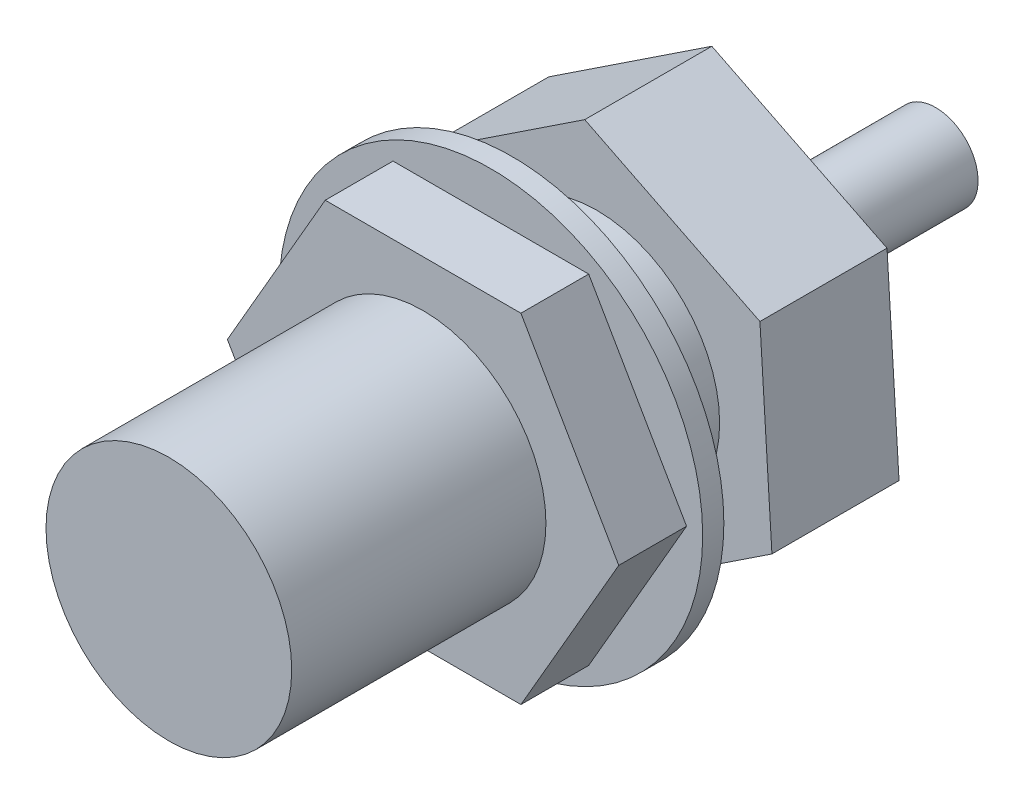
ISO-10303-21;
HEADER;
FILE_DESCRIPTION(('STEP AP214'),'2;1');
FILE_NAME('part.step','',(''),(''),'','','');
FILE_SCHEMA(('AUTOMOTIVE_DESIGN { 1 0 10303 214 1 1 1 1 }'));
ENDSEC;
DATA;
#1=APPLICATION_CONTEXT('core data for automotive mechanical design processes');
#2=APPLICATION_PROTOCOL_DEFINITION('international standard','automotive_design',2000,#1);
#3=PRODUCT_CONTEXT('',#1,'mechanical');
#4=PRODUCT('Part','Part','',(#3));
#5=PRODUCT_RELATED_PRODUCT_CATEGORY('part','',(#4));
#6=PRODUCT_DEFINITION_FORMATION('','',#4);
#7=PRODUCT_DEFINITION_CONTEXT('part definition',#1,'design');
#8=PRODUCT_DEFINITION('design','',#6,#7);
#9=PRODUCT_DEFINITION_SHAPE('','',#8);
#10=(LENGTH_UNIT() NAMED_UNIT(*) SI_UNIT(.MILLI.,.METRE.));
#11=(NAMED_UNIT(*) PLANE_ANGLE_UNIT() SI_UNIT($,.RADIAN.));
#12=(NAMED_UNIT(*) SI_UNIT($,.STERADIAN.) SOLID_ANGLE_UNIT());
#13=UNCERTAINTY_MEASURE_WITH_UNIT(LENGTH_MEASURE(1.E-05),#10,'distance_accuracy_value','');
#14=(GEOMETRIC_REPRESENTATION_CONTEXT(3) GLOBAL_UNCERTAINTY_ASSIGNED_CONTEXT((#13)) GLOBAL_UNIT_ASSIGNED_CONTEXT((#10,
#11,#12)) REPRESENTATION_CONTEXT('',''));
#15=CARTESIAN_POINT('',(0.,0.,0.));
#16=DIRECTION('',(0.,0.,1.));
#17=DIRECTION('',(1.,0.,0.));
#18=AXIS2_PLACEMENT_3D('',#15,#16,#17);
#19=CARTESIAN_POINT('',(0.,0.,3.));
#20=DIRECTION('',(0.,0.,-1.));
#21=DIRECTION('',(-1.,0.,0.));
#22=AXIS2_PLACEMENT_3D('',#19,#20,#21);
#23=CYLINDRICAL_SURFACE('',#22,2.9);
#24=CARTESIAN_POINT('',(0.,0.,3.));
#25=DIRECTION('',(0.,0.,1.));
#26=DIRECTION('',(1.,0.,0.));
#27=AXIS2_PLACEMENT_3D('',#24,#25,#26);
#28=CIRCLE('',#27,2.9);
#29=CARTESIAN_POINT('',(2.9,0.,3.));
#30=VERTEX_POINT('',#29);
#31=EDGE_CURVE('E148',#30,#30,#28,.T.);
#32=ORIENTED_EDGE('',*,*,#31,.F.);
#33=EDGE_LOOP('',(#32));
#34=FACE_BOUND('',#33,.T.);
#35=CARTESIAN_POINT('',(0.,0.,-3.));
#36=DIRECTION('',(0.,0.,1.));
#37=DIRECTION('',(1.,0.,0.));
#38=AXIS2_PLACEMENT_3D('',#35,#36,#37);
#39=CIRCLE('',#38,2.9);
#40=CARTESIAN_POINT('',(2.9,0.,-3.));
#41=VERTEX_POINT('',#40);
#42=EDGE_CURVE('E39',#41,#41,#39,.T.);
#43=ORIENTED_EDGE('',*,*,#42,.T.);
#44=EDGE_LOOP('',(#43));
#45=FACE_BOUND('',#44,.T.);
#46=ADVANCED_FACE('F36',(#34,#45),#23,.T.);
#47=CARTESIAN_POINT('',(0.,0.,3.));
#48=DIRECTION('',(0.,0.,1.));
#49=DIRECTION('',(1.,0.,0.));
#50=AXIS2_PLACEMENT_3D('',#47,#48,#49);
#51=PLANE('',#50);
#52=ORIENTED_EDGE('',*,*,#31,.T.);
#53=EDGE_LOOP('',(#52));
#54=FACE_BOUND('',#53,.T.);
#55=ADVANCED_FACE('F178',(#54),#51,.T.);
#56=CARTESIAN_POINT('',(-2.3094010767585,-4.,-4.6));
#57=DIRECTION('',(0.866025403784439,0.5,0.));
#58=DIRECTION('',(-0.5,0.866025403784439,0.));
#59=AXIS2_PLACEMENT_3D('',#56,#57,#58);
#60=PLANE('',#59);
#61=DIRECTION('',(-0.5,0.866025403784439,0.));
#62=VECTOR('',#61,1.);
#63=CARTESIAN_POINT('',(-2.3094010767585,-4.,-3.));
#64=LINE('',#63,#62);
#65=CARTESIAN_POINT('',(-2.3094010767585,-4.,-3.));
#66=VERTEX_POINT('',#65);
#67=CARTESIAN_POINT('',(-4.61880215351701,0.,-3.));
#68=VERTEX_POINT('',#67);
#69=EDGE_CURVE('E132',#66,#68,#64,.T.);
#70=ORIENTED_EDGE('',*,*,#69,.T.);
#71=DIRECTION('',(0.,0.,1.));
#72=VECTOR('',#71,1.);
#73=CARTESIAN_POINT('',(-4.61880215351701,0.,-4.6));
#74=LINE('',#73,#72);
#75=CARTESIAN_POINT('',(-4.61880215351701,0.,-4.6));
#76=VERTEX_POINT('',#75);
#77=EDGE_CURVE('E147',#76,#68,#74,.T.);
#78=ORIENTED_EDGE('',*,*,#77,.F.);
#79=DIRECTION('',(-0.5,0.866025403784439,0.));
#80=VECTOR('',#79,1.);
#81=CARTESIAN_POINT('',(-2.3094010767585,-4.,-4.6));
#82=LINE('',#81,#80);
#83=CARTESIAN_POINT('',(-2.3094010767585,-4.,-4.6));
#84=VERTEX_POINT('',#83);
#85=EDGE_CURVE('E124',#84,#76,#82,.T.);
#86=ORIENTED_EDGE('',*,*,#85,.F.);
#87=DIRECTION('',(0.,0.,1.));
#88=VECTOR('',#87,1.);
#89=CARTESIAN_POINT('',(-2.3094010767585,-4.,-4.6));
#90=LINE('',#89,#88);
#91=EDGE_CURVE('E131',#84,#66,#90,.T.);
#92=ORIENTED_EDGE('',*,*,#91,.T.);
#93=EDGE_LOOP('',(#70,#78,#86,#92));
#94=FACE_BOUND('',#93,.T.);
#95=ADVANCED_FACE('F165',(#94),#60,.F.);
#96=CARTESIAN_POINT('',(-4.61880215351701,0.,-4.6));
#97=DIRECTION('',(0.866025403784438,-0.5,0.));
#98=DIRECTION('',(0.5,0.866025403784438,0.));
#99=AXIS2_PLACEMENT_3D('',#96,#97,#98);
#100=PLANE('',#99);
#101=DIRECTION('',(0.5,0.866025403784438,0.));
#102=VECTOR('',#101,1.);
#103=CARTESIAN_POINT('',(-4.61880215351701,0.,-3.));
#104=LINE('',#103,#102);
#105=CARTESIAN_POINT('',(-2.3094010767585,4.,-3.));
#106=VERTEX_POINT('',#105);
#107=EDGE_CURVE('E135',#68,#106,#104,.T.);
#108=ORIENTED_EDGE('',*,*,#107,.T.);
#109=DIRECTION('',(0.,0.,1.));
#110=VECTOR('',#109,1.);
#111=CARTESIAN_POINT('',(-2.3094010767585,4.,-4.6));
#112=LINE('',#111,#110);
#113=CARTESIAN_POINT('',(-2.3094010767585,4.,-4.6));
#114=VERTEX_POINT('',#113);
#115=EDGE_CURVE('E110',#114,#106,#112,.T.);
#116=ORIENTED_EDGE('',*,*,#115,.F.);
#117=DIRECTION('',(0.5,0.866025403784438,0.));
#118=VECTOR('',#117,1.);
#119=CARTESIAN_POINT('',(-4.61880215351701,0.,-4.6));
#120=LINE('',#119,#118);
#121=EDGE_CURVE('E91',#76,#114,#120,.T.);
#122=ORIENTED_EDGE('',*,*,#121,.F.);
#123=ORIENTED_EDGE('',*,*,#77,.T.);
#124=EDGE_LOOP('',(#108,#116,#122,#123));
#125=FACE_BOUND('',#124,.T.);
#126=ADVANCED_FACE('F186',(#125),#100,.F.);
#127=CARTESIAN_POINT('',(-2.3094010767585,4.,-4.6));
#128=DIRECTION('',(0.,-1.,0.));
#129=DIRECTION('',(0.,0.,-1.));
#130=AXIS2_PLACEMENT_3D('',#127,#128,#129);
#131=PLANE('',#130);
#132=DIRECTION('',(1.,0.,0.));
#133=VECTOR('',#132,1.);
#134=CARTESIAN_POINT('',(-2.3094010767585,4.,-3.));
#135=LINE('',#134,#133);
#136=CARTESIAN_POINT('',(2.3094010767585,4.,-3.));
#137=VERTEX_POINT('',#136);
#138=EDGE_CURVE('E107',#106,#137,#135,.T.);
#139=ORIENTED_EDGE('',*,*,#138,.T.);
#140=DIRECTION('',(0.,0.,1.));
#141=VECTOR('',#140,1.);
#142=CARTESIAN_POINT('',(2.3094010767585,4.,-4.6));
#143=LINE('',#142,#141);
#144=CARTESIAN_POINT('',(2.3094010767585,4.,-4.6));
#145=VERTEX_POINT('',#144);
#146=EDGE_CURVE('E100',#145,#137,#143,.T.);
#147=ORIENTED_EDGE('',*,*,#146,.F.);
#148=DIRECTION('',(1.,0.,0.));
#149=VECTOR('',#148,1.);
#150=CARTESIAN_POINT('',(-2.3094010767585,4.,-4.6));
#151=LINE('',#150,#149);
#152=EDGE_CURVE('E105',#114,#145,#151,.T.);
#153=ORIENTED_EDGE('',*,*,#152,.F.);
#154=ORIENTED_EDGE('',*,*,#115,.T.);
#155=EDGE_LOOP('',(#139,#147,#153,#154));
#156=FACE_BOUND('',#155,.T.);
#157=ADVANCED_FACE('F102',(#156),#131,.F.);
#158=CARTESIAN_POINT('',(2.3094010767585,4.,-4.6));
#159=DIRECTION('',(-0.866025403784438,-0.5,0.));
#160=DIRECTION('',(0.5,-0.866025403784439,0.));
#161=AXIS2_PLACEMENT_3D('',#158,#159,#160);
#162=PLANE('',#161);
#163=DIRECTION('',(0.5,-0.866025403784438,0.));
#164=VECTOR('',#163,1.);
#165=CARTESIAN_POINT('',(2.3094010767585,4.,-3.));
#166=LINE('',#165,#164);
#167=CARTESIAN_POINT('',(4.61880215351701,0.,-3.));
#168=VERTEX_POINT('',#167);
#169=EDGE_CURVE('E139',#137,#168,#166,.T.);
#170=ORIENTED_EDGE('',*,*,#169,.T.);
#171=DIRECTION('',(0.,0.,1.));
#172=VECTOR('',#171,1.);
#173=CARTESIAN_POINT('',(4.61880215351701,0.,-4.6));
#174=LINE('',#173,#172);
#175=CARTESIAN_POINT('',(4.61880215351701,0.,-4.6));
#176=VERTEX_POINT('',#175);
#177=EDGE_CURVE('E111',#176,#168,#174,.T.);
#178=ORIENTED_EDGE('',*,*,#177,.F.);
#179=DIRECTION('',(0.5,-0.866025403784438,0.));
#180=VECTOR('',#179,1.);
#181=CARTESIAN_POINT('',(2.3094010767585,4.,-4.6));
#182=LINE('',#181,#180);
#183=EDGE_CURVE('E114',#145,#176,#182,.T.);
#184=ORIENTED_EDGE('',*,*,#183,.F.);
#185=ORIENTED_EDGE('',*,*,#146,.T.);
#186=EDGE_LOOP('',(#170,#178,#184,#185));
#187=FACE_BOUND('',#186,.T.);
#188=ADVANCED_FACE('F115',(#187),#162,.F.);
#189=CARTESIAN_POINT('',(4.61880215351701,0.,-4.6));
#190=DIRECTION('',(-0.866025403784438,0.5,0.));
#191=DIRECTION('',(-0.5,-0.866025403784439,0.));
#192=AXIS2_PLACEMENT_3D('',#189,#190,#191);
#193=PLANE('',#192);
#194=DIRECTION('',(-0.5,-0.866025403784439,0.));
#195=VECTOR('',#194,1.);
#196=CARTESIAN_POINT('',(4.61880215351701,0.,-3.));
#197=LINE('',#196,#195);
#198=CARTESIAN_POINT('',(2.3094010767585,-4.,-3.));
#199=VERTEX_POINT('',#198);
#200=EDGE_CURVE('E76',#168,#199,#197,.T.);
#201=ORIENTED_EDGE('',*,*,#200,.T.);
#202=DIRECTION('',(0.,0.,1.));
#203=VECTOR('',#202,1.);
#204=CARTESIAN_POINT('',(2.3094010767585,-4.,-4.6));
#205=LINE('',#204,#203);
#206=CARTESIAN_POINT('',(2.3094010767585,-4.,-4.6));
#207=VERTEX_POINT('',#206);
#208=EDGE_CURVE('E54',#207,#199,#205,.T.);
#209=ORIENTED_EDGE('',*,*,#208,.F.);
#210=DIRECTION('',(-0.5,-0.866025403784439,0.));
#211=VECTOR('',#210,1.);
#212=CARTESIAN_POINT('',(4.61880215351701,0.,-4.6));
#213=LINE('',#212,#211);
#214=EDGE_CURVE('E118',#176,#207,#213,.T.);
#215=ORIENTED_EDGE('',*,*,#214,.F.);
#216=ORIENTED_EDGE('',*,*,#177,.T.);
#217=EDGE_LOOP('',(#201,#209,#215,#216));
#218=FACE_BOUND('',#217,.T.);
#219=ADVANCED_FACE('F168',(#218),#193,.F.);
#220=CARTESIAN_POINT('',(2.3094010767585,-4.,-4.6));
#221=DIRECTION('',(0.,1.,0.));
#222=DIRECTION('',(-1.,0.,0.));
#223=AXIS2_PLACEMENT_3D('',#220,#221,#222);
#224=PLANE('',#223);
#225=DIRECTION('',(-1.,0.,0.));
#226=VECTOR('',#225,1.);
#227=CARTESIAN_POINT('',(2.3094010767585,-4.,-3.));
#228=LINE('',#227,#226);
#229=EDGE_CURVE('E82',#199,#66,#228,.T.);
#230=ORIENTED_EDGE('',*,*,#229,.T.);
#231=ORIENTED_EDGE('',*,*,#91,.F.);
#232=DIRECTION('',(-1.,0.,0.));
#233=VECTOR('',#232,1.);
#234=CARTESIAN_POINT('',(2.3094010767585,-4.,-4.6));
#235=LINE('',#234,#233);
#236=EDGE_CURVE('E129',#207,#84,#235,.T.);
#237=ORIENTED_EDGE('',*,*,#236,.F.);
#238=ORIENTED_EDGE('',*,*,#208,.T.);
#239=EDGE_LOOP('',(#230,#231,#237,#238));
#240=FACE_BOUND('',#239,.T.);
#241=ADVANCED_FACE('F161',(#240),#224,.F.);
#242=CARTESIAN_POINT('',(0.,0.,-3.));
#243=DIRECTION('',(0.,0.,-1.));
#244=DIRECTION('',(-1.,0.,0.));
#245=AXIS2_PLACEMENT_3D('',#242,#243,#244);
#246=PLANE('',#245);
#247=ORIENTED_EDGE('',*,*,#42,.F.);
#248=EDGE_LOOP('',(#247));
#249=FACE_BOUND('',#248,.T.);
#250=ORIENTED_EDGE('',*,*,#69,.F.);
#251=ORIENTED_EDGE('',*,*,#229,.F.);
#252=ORIENTED_EDGE('',*,*,#200,.F.);
#253=ORIENTED_EDGE('',*,*,#169,.F.);
#254=ORIENTED_EDGE('',*,*,#138,.F.);
#255=ORIENTED_EDGE('',*,*,#107,.F.);
#256=EDGE_LOOP('',(#250,#251,#252,#253,#254,#255));
#257=FACE_BOUND('',#256,.T.);
#258=ADVANCED_FACE('F158',(#249,#257),#246,.F.);
#259=CARTESIAN_POINT('',(0.,0.,-4.6));
#260=DIRECTION('',(0.,0.,-1.));
#261=DIRECTION('',(-1.,0.,0.));
#262=AXIS2_PLACEMENT_3D('',#259,#260,#261);
#263=PLANE('',#262);
#264=CARTESIAN_POINT('',(0.,0.,-4.6));
#265=DIRECTION('',(0.,0.,-1.));
#266=DIRECTION('',(-1.,0.,0.));
#267=AXIS2_PLACEMENT_3D('',#264,#265,#266);
#268=CIRCLE('',#267,5.);
#269=CARTESIAN_POINT('',(-5.,0.,-4.6));
#270=VERTEX_POINT('',#269);
#271=EDGE_CURVE('E418',#270,#270,#268,.T.);
#272=ORIENTED_EDGE('',*,*,#271,.F.);
#273=EDGE_LOOP('',(#272));
#274=FACE_BOUND('',#273,.T.);
#275=ORIENTED_EDGE('',*,*,#236,.T.);
#276=ORIENTED_EDGE('',*,*,#85,.T.);
#277=ORIENTED_EDGE('',*,*,#121,.T.);
#278=ORIENTED_EDGE('',*,*,#152,.T.);
#279=ORIENTED_EDGE('',*,*,#183,.T.);
#280=ORIENTED_EDGE('',*,*,#214,.T.);
#281=EDGE_LOOP('',(#275,#276,#277,#278,#279,#280));
#282=FACE_BOUND('',#281,.T.);
#283=ADVANCED_FACE('F121',(#274,#282),#263,.F.);
#284=CARTESIAN_POINT('',(0.,0.,-5.1));
#285=DIRECTION('',(0.,0.,1.));
#286=DIRECTION('',(1.,0.,0.));
#287=AXIS2_PLACEMENT_3D('',#284,#285,#286);
#288=CYLINDRICAL_SURFACE('',#287,5.);
#289=CARTESIAN_POINT('',(0.,0.,-5.1));
#290=DIRECTION('',(0.,0.,-1.));
#291=DIRECTION('',(-1.,0.,0.));
#292=AXIS2_PLACEMENT_3D('',#289,#290,#291);
#293=CIRCLE('',#292,5.);
#294=CARTESIAN_POINT('',(-5.,0.,-5.1));
#295=VERTEX_POINT('',#294);
#296=EDGE_CURVE('E136',#295,#295,#293,.T.);
#297=ORIENTED_EDGE('',*,*,#296,.F.);
#298=EDGE_LOOP('',(#297));
#299=FACE_BOUND('',#298,.T.);
#300=ORIENTED_EDGE('',*,*,#271,.T.);
#301=EDGE_LOOP('',(#300));
#302=FACE_BOUND('',#301,.T.);
#303=ADVANCED_FACE('F220',(#299,#302),#288,.T.);
#304=CARTESIAN_POINT('',(0.,0.,-5.1));
#305=DIRECTION('',(0.,0.,-1.));
#306=DIRECTION('',(-1.,0.,0.));
#307=AXIS2_PLACEMENT_3D('',#304,#305,#306);
#308=PLANE('',#307);
#309=CARTESIAN_POINT('',(0.,0.,-5.1));
#310=DIRECTION('',(0.,0.,-1.));
#311=DIRECTION('',(-1.,0.,0.));
#312=AXIS2_PLACEMENT_3D('',#309,#310,#311);
#313=CIRCLE('',#312,2.9);
#314=CARTESIAN_POINT('',(-2.9,0.,-5.1));
#315=VERTEX_POINT('',#314);
#316=EDGE_CURVE('E45',#315,#315,#313,.T.);
#317=ORIENTED_EDGE('',*,*,#316,.F.);
#318=EDGE_LOOP('',(#317));
#319=FACE_BOUND('',#318,.T.);
#320=ORIENTED_EDGE('',*,*,#296,.T.);
#321=EDGE_LOOP('',(#320));
#322=FACE_BOUND('',#321,.T.);
#323=ADVANCED_FACE('F230',(#319,#322),#308,.T.);
#324=CARTESIAN_POINT('',(0.,0.,-7.1));
#325=DIRECTION('',(0.,0.,1.));
#326=DIRECTION('',(1.,0.,0.));
#327=AXIS2_PLACEMENT_3D('',#324,#325,#326);
#328=CYLINDRICAL_SURFACE('',#327,2.9);
#329=CARTESIAN_POINT('',(0.,0.,-7.1));
#330=DIRECTION('',(0.,0.,-1.));
#331=DIRECTION('',(-1.,0.,0.));
#332=AXIS2_PLACEMENT_3D('',#329,#330,#331);
#333=CIRCLE('',#332,2.9);
#334=CARTESIAN_POINT('',(-2.9,0.,-7.1));
#335=VERTEX_POINT('',#334);
#336=EDGE_CURVE('E416',#335,#335,#333,.T.);
#337=ORIENTED_EDGE('',*,*,#336,.F.);
#338=EDGE_LOOP('',(#337));
#339=FACE_BOUND('',#338,.T.);
#340=ORIENTED_EDGE('',*,*,#316,.T.);
#341=EDGE_LOOP('',(#340));
#342=FACE_BOUND('',#341,.T.);
#343=ADVANCED_FACE('F240',(#339,#342),#328,.T.);
#344=CARTESIAN_POINT('',(-3.85049220223233,-2.55089065502255,-10.1));
#345=DIRECTION('',(0.998109301609293,0.0614639897908421,0.));
#346=DIRECTION('',(-0.0614639897908421,0.998109301609293,0.));
#347=AXIS2_PLACEMENT_3D('',#344,#345,#346);
#348=PLANE('',#347);
#349=DIRECTION('',(-0.0614639897908421,0.998109301609293,0.));
#350=VECTOR('',#349,1.);
#351=CARTESIAN_POINT('',(-3.85049220223233,-2.55089065502255,-7.1));
#352=LINE('',#351,#350);
#353=CARTESIAN_POINT('',(-3.85049220223233,-2.55089065502255,-7.1));
#354=VERTEX_POINT('',#353);
#355=CARTESIAN_POINT('',(-4.13438221064202,2.05917873669581,-7.1));
#356=VERTEX_POINT('',#355);
#357=EDGE_CURVE('E360',#354,#356,#352,.T.);
#358=ORIENTED_EDGE('',*,*,#357,.T.);
#359=DIRECTION('',(0.,0.,1.));
#360=VECTOR('',#359,1.);
#361=CARTESIAN_POINT('',(-4.13438221064202,2.05917873669581,-10.1));
#362=LINE('',#361,#360);
#363=CARTESIAN_POINT('',(-4.13438221064202,2.05917873669581,-10.1));
#364=VERTEX_POINT('',#363);
#365=EDGE_CURVE('E413',#364,#356,#362,.T.);
#366=ORIENTED_EDGE('',*,*,#365,.F.);
#367=DIRECTION('',(-0.0614639897908421,0.998109301609293,0.));
#368=VECTOR('',#367,1.);
#369=CARTESIAN_POINT('',(-3.85049220223233,-2.55089065502255,-10.1));
#370=LINE('',#369,#368);
#371=CARTESIAN_POINT('',(-3.85049220223233,-2.55089065502255,-10.1));
#372=VERTEX_POINT('',#371);
#373=EDGE_CURVE('E366',#372,#364,#370,.T.);
#374=ORIENTED_EDGE('',*,*,#373,.F.);
#375=DIRECTION('',(0.,0.,1.));
#376=VECTOR('',#375,1.);
#377=CARTESIAN_POINT('',(-3.85049220223233,-2.55089065502255,-10.1));
#378=LINE('',#377,#376);
#379=EDGE_CURVE('E384',#372,#354,#378,.T.);
#380=ORIENTED_EDGE('',*,*,#379,.T.);
#381=EDGE_LOOP('',(#358,#366,#374,#380));
#382=FACE_BOUND('',#381,.T.);
#383=ADVANCED_FACE('F250',(#382),#348,.F.);
#384=CARTESIAN_POINT('',(-4.13438221064202,2.05917873669581,-10.1));
#385=DIRECTION('',(0.552284027381463,-0.833656016051771,0.));
#386=DIRECTION('',(0.833656016051771,0.552284027381464,0.));
#387=AXIS2_PLACEMENT_3D('',#384,#385,#386);
#388=PLANE('',#387);
#389=DIRECTION('',(0.833656016051771,0.552284027381464,0.));
#390=VECTOR('',#389,1.);
#391=CARTESIAN_POINT('',(-4.13438221064202,2.05917873669581,-7.1));
#392=LINE('',#391,#390);
#393=CARTESIAN_POINT('',(-0.28389000840969,4.61006939171836,-7.1));
#394=VERTEX_POINT('',#393);
#395=EDGE_CURVE('E363',#356,#394,#392,.T.);
#396=ORIENTED_EDGE('',*,*,#395,.T.);
#397=DIRECTION('',(0.,0.,1.));
#398=VECTOR('',#397,1.);
#399=CARTESIAN_POINT('',(-0.28389000840969,4.61006939171836,-10.1));
#400=LINE('',#399,#398);
#401=CARTESIAN_POINT('',(-0.28389000840969,4.61006939171836,-10.1));
#402=VERTEX_POINT('',#401);
#403=EDGE_CURVE('E410',#402,#394,#400,.T.);
#404=ORIENTED_EDGE('',*,*,#403,.F.);
#405=DIRECTION('',(0.833656016051771,0.552284027381464,0.));
#406=VECTOR('',#405,1.);
#407=CARTESIAN_POINT('',(-4.13438221064202,2.05917873669581,-10.1));
#408=LINE('',#407,#406);
#409=EDGE_CURVE('E369',#364,#402,#408,.T.);
#410=ORIENTED_EDGE('',*,*,#409,.F.);
#411=ORIENTED_EDGE('',*,*,#365,.T.);
#412=EDGE_LOOP('',(#396,#404,#410,#411));
#413=FACE_BOUND('',#412,.T.);
#414=ADVANCED_FACE('F260',(#413),#388,.F.);
#415=CARTESIAN_POINT('',(-0.28389000840969,4.61006939171836,-10.1));
#416=DIRECTION('',(-0.44582527422783,-0.895120005842613,0.));
#417=DIRECTION('',(0.895120005842613,-0.44582527422783,0.));
#418=AXIS2_PLACEMENT_3D('',#415,#416,#417);
#419=PLANE('',#418);
#420=DIRECTION('',(0.895120005842613,-0.44582527422783,0.));
#421=VECTOR('',#420,1.);
#422=CARTESIAN_POINT('',(-0.28389000840969,4.61006939171836,-7.1));
#423=LINE('',#422,#421);
#424=CARTESIAN_POINT('',(3.85049220223233,2.55089065502255,-7.1));
#425=VERTEX_POINT('',#424);
#426=EDGE_CURVE('E388',#394,#425,#423,.T.);
#427=ORIENTED_EDGE('',*,*,#426,.T.);
#428=DIRECTION('',(0.,0.,1.));
#429=VECTOR('',#428,1.);
#430=CARTESIAN_POINT('',(3.85049220223233,2.55089065502255,-10.1));
#431=LINE('',#430,#429);
#432=CARTESIAN_POINT('',(3.85049220223233,2.55089065502255,-10.1));
#433=VERTEX_POINT('',#432);
#434=EDGE_CURVE('E407',#433,#425,#431,.T.);
#435=ORIENTED_EDGE('',*,*,#434,.F.);
#436=DIRECTION('',(0.895120005842613,-0.44582527422783,0.));
#437=VECTOR('',#436,1.);
#438=CARTESIAN_POINT('',(-0.28389000840969,4.61006939171836,-10.1));
#439=LINE('',#438,#437);
#440=EDGE_CURVE('E373',#402,#433,#439,.T.);
#441=ORIENTED_EDGE('',*,*,#440,.F.);
#442=ORIENTED_EDGE('',*,*,#403,.T.);
#443=EDGE_LOOP('',(#427,#435,#441,#442));
#444=FACE_BOUND('',#443,.T.);
#445=ADVANCED_FACE('F270',(#444),#419,.F.);
#446=CARTESIAN_POINT('',(3.85049220223233,2.55089065502255,-10.1));
#447=DIRECTION('',(-0.998109301609293,-0.061463989790842,0.));
#448=DIRECTION('',(0.0614639897908421,-0.998109301609293,0.));
#449=AXIS2_PLACEMENT_3D('',#446,#447,#448);
#450=PLANE('',#449);
#451=DIRECTION('',(0.061463989790842,-0.998109301609293,0.));
#452=VECTOR('',#451,1.);
#453=CARTESIAN_POINT('',(3.85049220223233,2.55089065502255,-7.1));
#454=LINE('',#453,#452);
#455=CARTESIAN_POINT('',(4.13438221064202,-2.05917873669581,-7.1));
#456=VERTEX_POINT('',#455);
#457=EDGE_CURVE('E391',#425,#456,#454,.T.);
#458=ORIENTED_EDGE('',*,*,#457,.T.);
#459=DIRECTION('',(0.,0.,1.));
#460=VECTOR('',#459,1.);
#461=CARTESIAN_POINT('',(4.13438221064202,-2.05917873669581,-10.1));
#462=LINE('',#461,#460);
#463=CARTESIAN_POINT('',(4.13438221064202,-2.05917873669581,-10.1));
#464=VERTEX_POINT('',#463);
#465=EDGE_CURVE('E404',#464,#456,#462,.T.);
#466=ORIENTED_EDGE('',*,*,#465,.F.);
#467=DIRECTION('',(0.061463989790842,-0.998109301609293,0.));
#468=VECTOR('',#467,1.);
#469=CARTESIAN_POINT('',(3.85049220223233,2.55089065502255,-10.1));
#470=LINE('',#469,#468);
#471=EDGE_CURVE('E376',#433,#464,#470,.T.);
#472=ORIENTED_EDGE('',*,*,#471,.F.);
#473=ORIENTED_EDGE('',*,*,#434,.T.);
#474=EDGE_LOOP('',(#458,#466,#472,#473));
#475=FACE_BOUND('',#474,.T.);
#476=ADVANCED_FACE('F280',(#475),#450,.F.);
#477=CARTESIAN_POINT('',(4.13438221064202,-2.05917873669581,-10.1));
#478=DIRECTION('',(-0.552284027381463,0.833656016051771,0.));
#479=DIRECTION('',(-0.833656016051771,-0.552284027381463,0.));
#480=AXIS2_PLACEMENT_3D('',#477,#478,#479);
#481=PLANE('',#480);
#482=DIRECTION('',(-0.833656016051771,-0.552284027381463,0.));
#483=VECTOR('',#482,1.);
#484=CARTESIAN_POINT('',(4.13438221064202,-2.05917873669581,-7.1));
#485=LINE('',#484,#483);
#486=CARTESIAN_POINT('',(0.283890008409689,-4.61006939171836,-7.1));
#487=VERTEX_POINT('',#486);
#488=EDGE_CURVE('E394',#456,#487,#485,.T.);
#489=ORIENTED_EDGE('',*,*,#488,.T.);
#490=DIRECTION('',(0.,0.,1.));
#491=VECTOR('',#490,1.);
#492=CARTESIAN_POINT('',(0.283890008409689,-4.61006939171836,-10.1));
#493=LINE('',#492,#491);
#494=CARTESIAN_POINT('',(0.283890008409689,-4.61006939171836,-10.1));
#495=VERTEX_POINT('',#494);
#496=EDGE_CURVE('E401',#495,#487,#493,.T.);
#497=ORIENTED_EDGE('',*,*,#496,.F.);
#498=DIRECTION('',(-0.833656016051771,-0.552284027381463,0.));
#499=VECTOR('',#498,1.);
#500=CARTESIAN_POINT('',(4.13438221064202,-2.05917873669581,-10.1));
#501=LINE('',#500,#499);
#502=EDGE_CURVE('E379',#464,#495,#501,.T.);
#503=ORIENTED_EDGE('',*,*,#502,.F.);
#504=ORIENTED_EDGE('',*,*,#465,.T.);
#505=EDGE_LOOP('',(#489,#497,#503,#504));
#506=FACE_BOUND('',#505,.T.);
#507=ADVANCED_FACE('F290',(#506),#481,.F.);
#508=CARTESIAN_POINT('',(0.283890008409689,-4.61006939171836,-10.1));
#509=DIRECTION('',(0.44582527422783,0.895120005842613,0.));
#510=DIRECTION('',(-0.895120005842613,0.44582527422783,0.));
#511=AXIS2_PLACEMENT_3D('',#508,#509,#510);
#512=PLANE('',#511);
#513=DIRECTION('',(-0.895120005842613,0.44582527422783,0.));
#514=VECTOR('',#513,1.);
#515=CARTESIAN_POINT('',(0.283890008409689,-4.61006939171836,-7.1));
#516=LINE('',#515,#514);
#517=EDGE_CURVE('E370',#487,#354,#516,.T.);
#518=ORIENTED_EDGE('',*,*,#517,.T.);
#519=ORIENTED_EDGE('',*,*,#379,.F.);
#520=DIRECTION('',(-0.895120005842613,0.44582527422783,0.));
#521=VECTOR('',#520,1.);
#522=CARTESIAN_POINT('',(0.283890008409689,-4.61006939171836,-10.1));
#523=LINE('',#522,#521);
#524=EDGE_CURVE('E382',#495,#372,#523,.T.);
#525=ORIENTED_EDGE('',*,*,#524,.F.);
#526=ORIENTED_EDGE('',*,*,#496,.T.);
#527=EDGE_LOOP('',(#518,#519,#525,#526));
#528=FACE_BOUND('',#527,.T.);
#529=ADVANCED_FACE('F300',(#528),#512,.F.);
#530=CARTESIAN_POINT('',(0.,0.,-10.1));
#531=DIRECTION('',(0.,0.,-1.));
#532=DIRECTION('',(-1.,0.,0.));
#533=AXIS2_PLACEMENT_3D('',#530,#531,#532);
#534=PLANE('',#533);
#535=CARTESIAN_POINT('',(0.,0.,-10.1));
#536=DIRECTION('',(0.,0.,-1.));
#537=DIRECTION('',(-1.,0.,0.));
#538=AXIS2_PLACEMENT_3D('',#535,#536,#537);
#539=CIRCLE('',#538,1.);
#540=CARTESIAN_POINT('',(-1.,0.,-10.1));
#541=VERTEX_POINT('',#540);
#542=EDGE_CURVE('E11',#541,#541,#539,.T.);
#543=ORIENTED_EDGE('',*,*,#542,.F.);
#544=EDGE_LOOP('',(#543));
#545=FACE_BOUND('',#544,.T.);
#546=ORIENTED_EDGE('',*,*,#373,.T.);
#547=ORIENTED_EDGE('',*,*,#409,.T.);
#548=ORIENTED_EDGE('',*,*,#440,.T.);
#549=ORIENTED_EDGE('',*,*,#471,.T.);
#550=ORIENTED_EDGE('',*,*,#502,.T.);
#551=ORIENTED_EDGE('',*,*,#524,.T.);
#552=EDGE_LOOP('',(#546,#547,#548,#549,#550,#551));
#553=FACE_BOUND('',#552,.T.);
#554=ADVANCED_FACE('F310',(#545,#553),#534,.T.);
#555=CARTESIAN_POINT('',(0.,0.,-7.1));
#556=DIRECTION('',(0.,0.,-1.));
#557=DIRECTION('',(-1.,0.,0.));
#558=AXIS2_PLACEMENT_3D('',#555,#556,#557);
#559=PLANE('',#558);
#560=ORIENTED_EDGE('',*,*,#336,.T.);
#561=EDGE_LOOP('',(#560));
#562=FACE_BOUND('',#561,.T.);
#563=ORIENTED_EDGE('',*,*,#357,.F.);
#564=ORIENTED_EDGE('',*,*,#517,.F.);
#565=ORIENTED_EDGE('',*,*,#488,.F.);
#566=ORIENTED_EDGE('',*,*,#457,.F.);
#567=ORIENTED_EDGE('',*,*,#426,.F.);
#568=ORIENTED_EDGE('',*,*,#395,.F.);
#569=EDGE_LOOP('',(#563,#564,#565,#566,#567,#568));
#570=FACE_BOUND('',#569,.T.);
#571=ADVANCED_FACE('F318',(#562,#570),#559,.F.);
#572=CARTESIAN_POINT('',(0.,0.,-15.1));
#573=DIRECTION('',(0.,0.,1.));
#574=DIRECTION('',(1.,0.,0.));
#575=AXIS2_PLACEMENT_3D('',#572,#573,#574);
#576=CYLINDRICAL_SURFACE('',#575,1.);
#577=CARTESIAN_POINT('',(0.,0.,-15.1));
#578=DIRECTION('',(0.,0.,-1.));
#579=DIRECTION('',(-1.,0.,0.));
#580=AXIS2_PLACEMENT_3D('',#577,#578,#579);
#581=CIRCLE('',#580,1.);
#582=CARTESIAN_POINT('',(-1.,0.,-15.1));
#583=VERTEX_POINT('',#582);
#584=EDGE_CURVE('E359',#583,#583,#581,.T.);
#585=ORIENTED_EDGE('',*,*,#584,.F.);
#586=EDGE_LOOP('',(#585));
#587=FACE_BOUND('',#586,.T.);
#588=ORIENTED_EDGE('',*,*,#542,.T.);
#589=EDGE_LOOP('',(#588));
#590=FACE_BOUND('',#589,.T.);
#591=ADVANCED_FACE('F323',(#587,#590),#576,.T.);
#592=CARTESIAN_POINT('',(0.,0.,-15.1));
#593=DIRECTION('',(0.,0.,-1.));
#594=DIRECTION('',(-1.,0.,0.));
#595=AXIS2_PLACEMENT_3D('',#592,#593,#594);
#596=PLANE('',#595);
#597=ORIENTED_EDGE('',*,*,#584,.T.);
#598=EDGE_LOOP('',(#597));
#599=FACE_BOUND('',#598,.T.);
#600=ADVANCED_FACE('F341',(#599),#596,.T.);
#601=CLOSED_SHELL('',(#46,#55,#95,#126,#157,#188,#219,#241,#258,#283,#303,#323,#343,#383,#414,
#445,#476,#507,#529,#554,#571,#591,#600));
#602=MANIFOLD_SOLID_BREP('B2',#601);
#603=ADVANCED_BREP_SHAPE_REPRESENTATION('',(#18,#602),#14);
#604=SHAPE_DEFINITION_REPRESENTATION(#9,#603);
ENDSEC;
END-ISO-10303-21;
